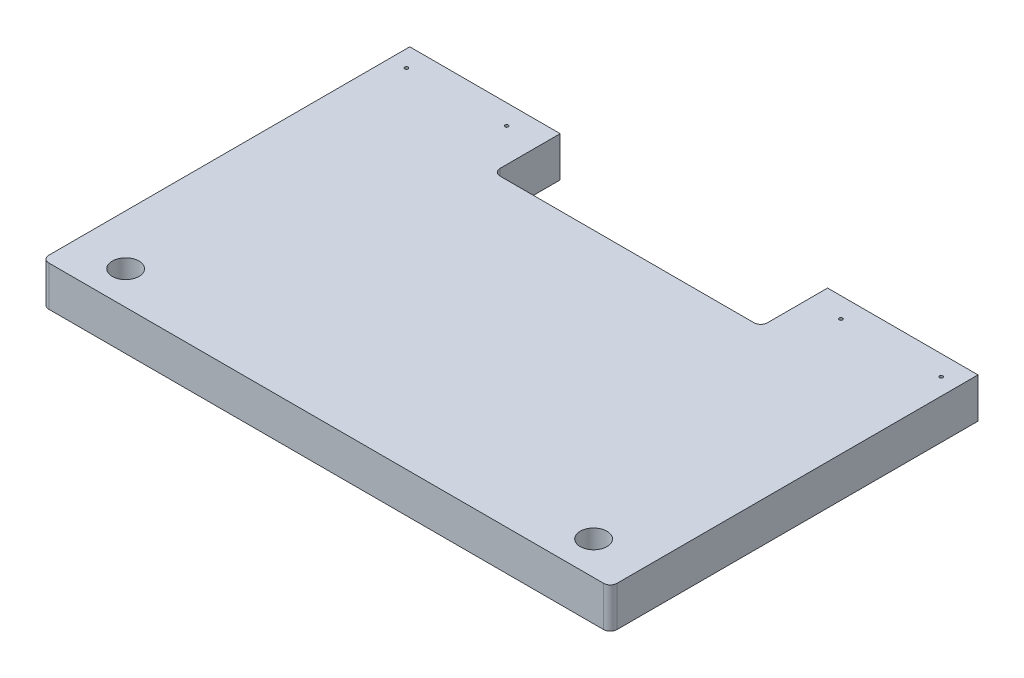
ISO-10303-21;
HEADER;
FILE_DESCRIPTION(('STEP AP214'),'2;1');
FILE_NAME('part.step','',(''),(''),'','','');
FILE_SCHEMA(('AUTOMOTIVE_DESIGN { 1 0 10303 214 1 1 1 1 }'));
ENDSEC;
DATA;
#1=APPLICATION_CONTEXT('core data for automotive mechanical design processes');
#2=APPLICATION_PROTOCOL_DEFINITION('international standard','automotive_design',2000,#1);
#3=PRODUCT_CONTEXT('',#1,'mechanical');
#4=PRODUCT('Part','Part','',(#3));
#5=PRODUCT_RELATED_PRODUCT_CATEGORY('part','',(#4));
#6=PRODUCT_DEFINITION_FORMATION('','',#4);
#7=PRODUCT_DEFINITION_CONTEXT('part definition',#1,'design');
#8=PRODUCT_DEFINITION('design','',#6,#7);
#9=PRODUCT_DEFINITION_SHAPE('','',#8);
#10=(LENGTH_UNIT() NAMED_UNIT(*) SI_UNIT(.MILLI.,.METRE.));
#11=(NAMED_UNIT(*) PLANE_ANGLE_UNIT() SI_UNIT($,.RADIAN.));
#12=(NAMED_UNIT(*) SI_UNIT($,.STERADIAN.) SOLID_ANGLE_UNIT());
#13=UNCERTAINTY_MEASURE_WITH_UNIT(LENGTH_MEASURE(1.E-05),#10,'distance_accuracy_value','');
#14=(GEOMETRIC_REPRESENTATION_CONTEXT(3) GLOBAL_UNCERTAINTY_ASSIGNED_CONTEXT((#13)) GLOBAL_UNIT_ASSIGNED_CONTEXT((#10,
#11,#12)) REPRESENTATION_CONTEXT('',''));
#15=CARTESIAN_POINT('',(0.,0.,0.));
#16=DIRECTION('',(0.,0.,1.));
#17=DIRECTION('',(1.,0.,0.));
#18=AXIS2_PLACEMENT_3D('',#15,#16,#17);
#19=CARTESIAN_POINT('',(0.,12.,0.));
#20=DIRECTION('',(0.,-1.,0.));
#21=DIRECTION('',(0.,0.,-1.));
#22=AXIS2_PLACEMENT_3D('',#19,#20,#21);
#23=PLANE('',#22);
#24=DIRECTION('',(1.,0.,0.));
#25=VECTOR('',#24,1.);
#26=CARTESIAN_POINT('',(0.,12.,0.));
#27=LINE('',#26,#25);
#28=CARTESIAN_POINT('',(2.,12.,0.));
#29=VERTEX_POINT('',#28);
#30=CARTESIAN_POINT('',(168.,12.,0.));
#31=VERTEX_POINT('',#30);
#32=EDGE_CURVE('E138',#29,#31,#27,.T.);
#33=ORIENTED_EDGE('',*,*,#32,.T.);
#34=CARTESIAN_POINT('',(168.,12.,-2.00000000000002));
#35=DIRECTION('',(0.,-1.,0.));
#36=DIRECTION('',(0.,0.,-1.));
#37=AXIS2_PLACEMENT_3D('',#34,#35,#36);
#38=CIRCLE('',#37,2.);
#39=CARTESIAN_POINT('',(170.,12.,-2.00000000000002));
#40=VERTEX_POINT('',#39);
#41=EDGE_CURVE('E134',#31,#40,#38,.F.);
#42=ORIENTED_EDGE('',*,*,#41,.T.);
#43=DIRECTION('',(0.,0.,-1.));
#44=VECTOR('',#43,1.);
#45=CARTESIAN_POINT('',(170.,12.,0.));
#46=LINE('',#45,#44);
#47=CARTESIAN_POINT('',(170.,12.,-110.));
#48=VERTEX_POINT('',#47);
#49=EDGE_CURVE('E126',#40,#48,#46,.T.);
#50=ORIENTED_EDGE('',*,*,#49,.T.);
#51=DIRECTION('',(-1.,0.,0.));
#52=VECTOR('',#51,1.);
#53=CARTESIAN_POINT('',(125.,12.,-110.));
#54=LINE('',#53,#52);
#55=CARTESIAN_POINT('',(125.,12.,-110.));
#56=VERTEX_POINT('',#55);
#57=EDGE_CURVE('E131',#48,#56,#54,.T.);
#58=ORIENTED_EDGE('',*,*,#57,.T.);
#59=DIRECTION('',(0.,0.,1.));
#60=VECTOR('',#59,1.);
#61=CARTESIAN_POINT('',(125.,12.,-90.));
#62=LINE('',#61,#60);
#63=CARTESIAN_POINT('',(125.,12.,-92.));
#64=VERTEX_POINT('',#63);
#65=EDGE_CURVE('E153',#56,#64,#62,.T.);
#66=ORIENTED_EDGE('',*,*,#65,.T.);
#67=CARTESIAN_POINT('',(123.,12.,-92.));
#68=DIRECTION('',(0.,-1.,0.));
#69=DIRECTION('',(0.,0.,-1.));
#70=AXIS2_PLACEMENT_3D('',#67,#68,#69);
#71=CIRCLE('',#70,2.);
#72=CARTESIAN_POINT('',(123.,12.,-90.));
#73=VERTEX_POINT('',#72);
#74=EDGE_CURVE('E216',#64,#73,#71,.T.);
#75=ORIENTED_EDGE('',*,*,#74,.T.);
#76=DIRECTION('',(-1.,0.,0.));
#77=VECTOR('',#76,1.);
#78=CARTESIAN_POINT('',(45.,12.,-90.));
#79=LINE('',#78,#77);
#80=CARTESIAN_POINT('',(47.,12.,-90.));
#81=VERTEX_POINT('',#80);
#82=EDGE_CURVE('E155',#73,#81,#79,.T.);
#83=ORIENTED_EDGE('',*,*,#82,.T.);
#84=CARTESIAN_POINT('',(47.,12.,-92.));
#85=DIRECTION('',(0.,-1.,0.));
#86=DIRECTION('',(0.,0.,-1.));
#87=AXIS2_PLACEMENT_3D('',#84,#85,#86);
#88=CIRCLE('',#87,2.);
#89=CARTESIAN_POINT('',(45.,12.,-92.));
#90=VERTEX_POINT('',#89);
#91=EDGE_CURVE('E12',#81,#90,#88,.T.);
#92=ORIENTED_EDGE('',*,*,#91,.T.);
#93=DIRECTION('',(0.,0.,-1.));
#94=VECTOR('',#93,1.);
#95=CARTESIAN_POINT('',(45.,12.,-110.));
#96=LINE('',#95,#94);
#97=CARTESIAN_POINT('',(45.,12.,-110.));
#98=VERTEX_POINT('',#97);
#99=EDGE_CURVE('E161',#90,#98,#96,.T.);
#100=ORIENTED_EDGE('',*,*,#99,.T.);
#101=DIRECTION('',(-1.,0.,0.));
#102=VECTOR('',#101,1.);
#103=CARTESIAN_POINT('',(0.,12.,-110.));
#104=LINE('',#103,#102);
#105=CARTESIAN_POINT('',(0.,12.,-110.));
#106=VERTEX_POINT('',#105);
#107=EDGE_CURVE('E163',#98,#106,#104,.T.);
#108=ORIENTED_EDGE('',*,*,#107,.T.);
#109=DIRECTION('',(0.,0.,1.));
#110=VECTOR('',#109,1.);
#111=CARTESIAN_POINT('',(0.,12.,0.));
#112=LINE('',#111,#110);
#113=CARTESIAN_POINT('',(0.,12.,-2.));
#114=VERTEX_POINT('',#113);
#115=EDGE_CURVE('E184',#106,#114,#112,.T.);
#116=ORIENTED_EDGE('',*,*,#115,.T.);
#117=CARTESIAN_POINT('',(2.,12.,-2.));
#118=DIRECTION('',(0.,-1.,0.));
#119=DIRECTION('',(0.,0.,-1.));
#120=AXIS2_PLACEMENT_3D('',#117,#118,#119);
#121=CIRCLE('',#120,2.);
#122=EDGE_CURVE('E210',#114,#29,#121,.F.);
#123=ORIENTED_EDGE('',*,*,#122,.T.);
#124=EDGE_LOOP('',(#33,#42,#50,#58,#66,#75,#83,#92,#100,#108,#116,#123));
#125=FACE_BOUND('',#124,.T.);
#126=CARTESIAN_POINT('',(155.,12.,-10.));
#127=DIRECTION('',(0.,1.,0.));
#128=DIRECTION('',(0.,0.,1.));
#129=AXIS2_PLACEMENT_3D('',#126,#127,#128);
#130=CIRCLE('',#129,3.99999999999999);
#131=CARTESIAN_POINT('',(155.,12.,-6.00000000000001));
#132=VERTEX_POINT('',#131);
#133=EDGE_CURVE('E169',#132,#132,#130,.T.);
#134=ORIENTED_EDGE('',*,*,#133,.F.);
#135=EDGE_LOOP('',(#134));
#136=FACE_BOUND('',#135,.T.);
#137=CARTESIAN_POINT('',(15.,12.,-10.));
#138=DIRECTION('',(0.,1.,0.));
#139=DIRECTION('',(0.,0.,-1.));
#140=AXIS2_PLACEMENT_3D('',#137,#138,#139);
#141=CIRCLE('',#140,3.99999999999999);
#142=CARTESIAN_POINT('',(15.,12.,-14.));
#143=VERTEX_POINT('',#142);
#144=EDGE_CURVE('E323',#143,#143,#141,.T.);
#145=ORIENTED_EDGE('',*,*,#144,.F.);
#146=EDGE_LOOP('',(#145));
#147=FACE_BOUND('',#146,.T.);
#148=CARTESIAN_POINT('',(5.,12.,-104.));
#149=DIRECTION('',(0.,1.,0.));
#150=DIRECTION('',(0.,0.,1.));
#151=AXIS2_PLACEMENT_3D('',#148,#149,#150);
#152=CIRCLE('',#151,0.500000000000002);
#153=CARTESIAN_POINT('',(5.,12.,-103.5));
#154=VERTEX_POINT('',#153);
#155=EDGE_CURVE('E327',#154,#154,#152,.T.);
#156=ORIENTED_EDGE('',*,*,#155,.F.);
#157=EDGE_LOOP('',(#156));
#158=FACE_BOUND('',#157,.T.);
#159=CARTESIAN_POINT('',(35.,12.,-104.));
#160=DIRECTION('',(0.,1.,0.));
#161=DIRECTION('',(0.,0.,1.));
#162=AXIS2_PLACEMENT_3D('',#159,#160,#161);
#163=CIRCLE('',#162,0.499999999999999);
#164=CARTESIAN_POINT('',(35.,12.,-103.5));
#165=VERTEX_POINT('',#164);
#166=EDGE_CURVE('E346',#165,#165,#163,.T.);
#167=ORIENTED_EDGE('',*,*,#166,.F.);
#168=EDGE_LOOP('',(#167));
#169=FACE_BOUND('',#168,.T.);
#170=CARTESIAN_POINT('',(165.,12.,-104.));
#171=DIRECTION('',(0.,1.,0.));
#172=DIRECTION('',(0.,0.,-1.));
#173=AXIS2_PLACEMENT_3D('',#170,#171,#172);
#174=CIRCLE('',#173,0.499999999999999);
#175=CARTESIAN_POINT('',(165.,12.,-104.5));
#176=VERTEX_POINT('',#175);
#177=EDGE_CURVE('E355',#176,#176,#174,.T.);
#178=ORIENTED_EDGE('',*,*,#177,.F.);
#179=EDGE_LOOP('',(#178));
#180=FACE_BOUND('',#179,.T.);
#181=CARTESIAN_POINT('',(135.,12.,-104.));
#182=DIRECTION('',(0.,1.,0.));
#183=DIRECTION('',(0.,0.,-1.));
#184=AXIS2_PLACEMENT_3D('',#181,#182,#183);
#185=CIRCLE('',#184,0.499999999999999);
#186=CARTESIAN_POINT('',(135.,12.,-104.5));
#187=VERTEX_POINT('',#186);
#188=EDGE_CURVE('E369',#187,#187,#185,.T.);
#189=ORIENTED_EDGE('',*,*,#188,.F.);
#190=EDGE_LOOP('',(#189));
#191=FACE_BOUND('',#190,.T.);
#192=ADVANCED_FACE('F35',(#125,#136,#147,#158,#169,#180,#191),#23,.F.);
#193=CARTESIAN_POINT('',(0.,0.,0.));
#194=DIRECTION('',(0.,-1.,0.));
#195=DIRECTION('',(0.,0.,-1.));
#196=AXIS2_PLACEMENT_3D('',#193,#194,#195);
#197=PLANE('',#196);
#198=CARTESIAN_POINT('',(165.,0.,-104.));
#199=DIRECTION('',(0.,1.,0.));
#200=DIRECTION('',(0.,0.,-1.));
#201=AXIS2_PLACEMENT_3D('',#198,#199,#200);
#202=CIRCLE('',#201,0.499999999999999);
#203=CARTESIAN_POINT('',(165.,0.,-104.5));
#204=VERTEX_POINT('',#203);
#205=EDGE_CURVE('E352',#204,#204,#202,.T.);
#206=ORIENTED_EDGE('',*,*,#205,.T.);
#207=EDGE_LOOP('',(#206));
#208=FACE_BOUND('',#207,.T.);
#209=CARTESIAN_POINT('',(5.,0.,-104.));
#210=DIRECTION('',(0.,1.,0.));
#211=DIRECTION('',(0.,0.,1.));
#212=AXIS2_PLACEMENT_3D('',#209,#210,#211);
#213=CIRCLE('',#212,0.500000000000002);
#214=CARTESIAN_POINT('',(5.,0.,-103.5));
#215=VERTEX_POINT('',#214);
#216=EDGE_CURVE('E332',#215,#215,#213,.T.);
#217=ORIENTED_EDGE('',*,*,#216,.T.);
#218=EDGE_LOOP('',(#217));
#219=FACE_BOUND('',#218,.T.);
#220=CARTESIAN_POINT('',(155.,0.,-10.));
#221=DIRECTION('',(0.,1.,0.));
#222=DIRECTION('',(0.,0.,1.));
#223=AXIS2_PLACEMENT_3D('',#220,#221,#222);
#224=CIRCLE('',#223,3.99999999999999);
#225=CARTESIAN_POINT('',(155.,0.,-6.00000000000001));
#226=VERTEX_POINT('',#225);
#227=EDGE_CURVE('E329',#226,#226,#224,.T.);
#228=ORIENTED_EDGE('',*,*,#227,.T.);
#229=EDGE_LOOP('',(#228));
#230=FACE_BOUND('',#229,.T.);
#231=DIRECTION('',(0.,0.,-1.));
#232=VECTOR('',#231,1.);
#233=CARTESIAN_POINT('',(170.,0.,0.));
#234=LINE('',#233,#232);
#235=CARTESIAN_POINT('',(170.,0.,-2.00000000000002));
#236=VERTEX_POINT('',#235);
#237=CARTESIAN_POINT('',(170.,0.,-110.));
#238=VERTEX_POINT('',#237);
#239=EDGE_CURVE('E144',#236,#238,#234,.T.);
#240=ORIENTED_EDGE('',*,*,#239,.F.);
#241=CARTESIAN_POINT('',(168.,0.,-2.00000000000002));
#242=DIRECTION('',(0.,-1.,0.));
#243=DIRECTION('',(0.,0.,-1.));
#244=AXIS2_PLACEMENT_3D('',#241,#242,#243);
#245=CIRCLE('',#244,2.);
#246=CARTESIAN_POINT('',(168.,0.,0.));
#247=VERTEX_POINT('',#246);
#248=EDGE_CURVE('E204',#236,#247,#245,.T.);
#249=ORIENTED_EDGE('',*,*,#248,.T.);
#250=DIRECTION('',(1.,0.,0.));
#251=VECTOR('',#250,1.);
#252=CARTESIAN_POINT('',(0.,0.,0.));
#253=LINE('',#252,#251);
#254=CARTESIAN_POINT('',(2.,0.,0.));
#255=VERTEX_POINT('',#254);
#256=EDGE_CURVE('E168',#255,#247,#253,.T.);
#257=ORIENTED_EDGE('',*,*,#256,.F.);
#258=CARTESIAN_POINT('',(2.,0.,-2.));
#259=DIRECTION('',(0.,-1.,0.));
#260=DIRECTION('',(0.,0.,-1.));
#261=AXIS2_PLACEMENT_3D('',#258,#259,#260);
#262=CIRCLE('',#261,2.);
#263=CARTESIAN_POINT('',(0.,0.,-2.));
#264=VERTEX_POINT('',#263);
#265=EDGE_CURVE('E202',#255,#264,#262,.T.);
#266=ORIENTED_EDGE('',*,*,#265,.T.);
#267=DIRECTION('',(0.,0.,1.));
#268=VECTOR('',#267,1.);
#269=CARTESIAN_POINT('',(0.,0.,0.));
#270=LINE('',#269,#268);
#271=CARTESIAN_POINT('',(0.,0.,-110.));
#272=VERTEX_POINT('',#271);
#273=EDGE_CURVE('E166',#272,#264,#270,.T.);
#274=ORIENTED_EDGE('',*,*,#273,.F.);
#275=DIRECTION('',(-1.,0.,0.));
#276=VECTOR('',#275,1.);
#277=CARTESIAN_POINT('',(0.,0.,-110.));
#278=LINE('',#277,#276);
#279=CARTESIAN_POINT('',(45.,0.,-110.));
#280=VERTEX_POINT('',#279);
#281=EDGE_CURVE('E182',#280,#272,#278,.T.);
#282=ORIENTED_EDGE('',*,*,#281,.F.);
#283=DIRECTION('',(0.,0.,-1.));
#284=VECTOR('',#283,1.);
#285=CARTESIAN_POINT('',(45.,0.,-110.));
#286=LINE('',#285,#284);
#287=CARTESIAN_POINT('',(45.,0.,-92.));
#288=VERTEX_POINT('',#287);
#289=EDGE_CURVE('E180',#288,#280,#286,.T.);
#290=ORIENTED_EDGE('',*,*,#289,.F.);
#291=CARTESIAN_POINT('',(47.,0.,-92.));
#292=DIRECTION('',(0.,-1.,0.));
#293=DIRECTION('',(0.,0.,-1.));
#294=AXIS2_PLACEMENT_3D('',#291,#292,#293);
#295=CIRCLE('',#294,2.);
#296=CARTESIAN_POINT('',(47.,0.,-90.));
#297=VERTEX_POINT('',#296);
#298=EDGE_CURVE('E43',#288,#297,#295,.F.);
#299=ORIENTED_EDGE('',*,*,#298,.T.);
#300=DIRECTION('',(-1.,0.,0.));
#301=VECTOR('',#300,1.);
#302=CARTESIAN_POINT('',(45.,0.,-90.));
#303=LINE('',#302,#301);
#304=CARTESIAN_POINT('',(123.,0.,-90.));
#305=VERTEX_POINT('',#304);
#306=EDGE_CURVE('E177',#305,#297,#303,.T.);
#307=ORIENTED_EDGE('',*,*,#306,.F.);
#308=CARTESIAN_POINT('',(123.,0.,-92.));
#309=DIRECTION('',(0.,-1.,0.));
#310=DIRECTION('',(0.,0.,-1.));
#311=AXIS2_PLACEMENT_3D('',#308,#309,#310);
#312=CIRCLE('',#311,2.);
#313=CARTESIAN_POINT('',(125.,0.,-92.));
#314=VERTEX_POINT('',#313);
#315=EDGE_CURVE('E214',#305,#314,#312,.F.);
#316=ORIENTED_EDGE('',*,*,#315,.T.);
#317=DIRECTION('',(0.,0.,1.));
#318=VECTOR('',#317,1.);
#319=CARTESIAN_POINT('',(125.,0.,-90.));
#320=LINE('',#319,#318);
#321=CARTESIAN_POINT('',(125.,0.,-110.));
#322=VERTEX_POINT('',#321);
#323=EDGE_CURVE('E174',#322,#314,#320,.T.);
#324=ORIENTED_EDGE('',*,*,#323,.F.);
#325=DIRECTION('',(-1.,0.,0.));
#326=VECTOR('',#325,1.);
#327=CARTESIAN_POINT('',(125.,0.,-110.));
#328=LINE('',#327,#326);
#329=EDGE_CURVE('E172',#238,#322,#328,.T.);
#330=ORIENTED_EDGE('',*,*,#329,.F.);
#331=EDGE_LOOP('',(#240,#249,#257,#266,#274,#282,#290,#299,#307,#316,#324,#330));
#332=FACE_BOUND('',#331,.T.);
#333=CARTESIAN_POINT('',(15.,0.,-10.));
#334=DIRECTION('',(0.,1.,0.));
#335=DIRECTION('',(0.,0.,-1.));
#336=AXIS2_PLACEMENT_3D('',#333,#334,#335);
#337=CIRCLE('',#336,3.99999999999999);
#338=CARTESIAN_POINT('',(15.,0.,-14.));
#339=VERTEX_POINT('',#338);
#340=EDGE_CURVE('E326',#339,#339,#337,.T.);
#341=ORIENTED_EDGE('',*,*,#340,.T.);
#342=EDGE_LOOP('',(#341));
#343=FACE_BOUND('',#342,.T.);
#344=CARTESIAN_POINT('',(35.,0.,-104.));
#345=DIRECTION('',(0.,1.,0.));
#346=DIRECTION('',(0.,0.,1.));
#347=AXIS2_PLACEMENT_3D('',#344,#345,#346);
#348=CIRCLE('',#347,0.499999999999999);
#349=CARTESIAN_POINT('',(35.,0.,-103.5));
#350=VERTEX_POINT('',#349);
#351=EDGE_CURVE('E351',#350,#350,#348,.T.);
#352=ORIENTED_EDGE('',*,*,#351,.T.);
#353=EDGE_LOOP('',(#352));
#354=FACE_BOUND('',#353,.T.);
#355=CARTESIAN_POINT('',(135.,0.,-104.));
#356=DIRECTION('',(0.,1.,0.));
#357=DIRECTION('',(0.,0.,-1.));
#358=AXIS2_PLACEMENT_3D('',#355,#356,#357);
#359=CIRCLE('',#358,0.499999999999999);
#360=CARTESIAN_POINT('',(135.,0.,-104.5));
#361=VERTEX_POINT('',#360);
#362=EDGE_CURVE('E372',#361,#361,#359,.T.);
#363=ORIENTED_EDGE('',*,*,#362,.T.);
#364=EDGE_LOOP('',(#363));
#365=FACE_BOUND('',#364,.T.);
#366=ADVANCED_FACE('F220',(#208,#219,#230,#332,#343,#354,#365),#197,.T.);
#367=CARTESIAN_POINT('',(0.,12.,0.));
#368=DIRECTION('',(1.,0.,0.));
#369=DIRECTION('',(0.,0.,-1.));
#370=AXIS2_PLACEMENT_3D('',#367,#368,#369);
#371=PLANE('',#370);
#372=ORIENTED_EDGE('',*,*,#273,.T.);
#373=DIRECTION('',(0.,-1.,0.));
#374=VECTOR('',#373,1.);
#375=CARTESIAN_POINT('',(0.,12.,-2.));
#376=LINE('',#375,#374);
#377=EDGE_CURVE('E50',#264,#114,#376,.F.);
#378=ORIENTED_EDGE('',*,*,#377,.T.);
#379=ORIENTED_EDGE('',*,*,#115,.F.);
#380=DIRECTION('',(0.,-1.,0.));
#381=VECTOR('',#380,1.);
#382=CARTESIAN_POINT('',(0.,12.,-110.));
#383=LINE('',#382,#381);
#384=EDGE_CURVE('E165',#106,#272,#383,.T.);
#385=ORIENTED_EDGE('',*,*,#384,.T.);
#386=EDGE_LOOP('',(#372,#378,#379,#385));
#387=FACE_BOUND('',#386,.T.);
#388=ADVANCED_FACE('F261',(#387),#371,.F.);
#389=CARTESIAN_POINT('',(0.,12.,0.));
#390=DIRECTION('',(0.,0.,-1.));
#391=DIRECTION('',(-1.,0.,0.));
#392=AXIS2_PLACEMENT_3D('',#389,#390,#391);
#393=PLANE('',#392);
#394=ORIENTED_EDGE('',*,*,#256,.T.);
#395=DIRECTION('',(0.,-1.,0.));
#396=VECTOR('',#395,1.);
#397=CARTESIAN_POINT('',(168.,12.,0.));
#398=LINE('',#397,#396);
#399=EDGE_CURVE('E58',#247,#31,#398,.F.);
#400=ORIENTED_EDGE('',*,*,#399,.T.);
#401=ORIENTED_EDGE('',*,*,#32,.F.);
#402=DIRECTION('',(0.,-1.,0.));
#403=VECTOR('',#402,1.);
#404=CARTESIAN_POINT('',(2.,12.,0.));
#405=LINE('',#404,#403);
#406=EDGE_CURVE('E206',#29,#255,#405,.T.);
#407=ORIENTED_EDGE('',*,*,#406,.T.);
#408=EDGE_LOOP('',(#394,#400,#401,#407));
#409=FACE_BOUND('',#408,.T.);
#410=ADVANCED_FACE('F245',(#409),#393,.F.);
#411=CARTESIAN_POINT('',(170.,12.,0.));
#412=DIRECTION('',(-1.,0.,0.));
#413=DIRECTION('',(0.,0.,1.));
#414=AXIS2_PLACEMENT_3D('',#411,#412,#413);
#415=PLANE('',#414);
#416=ORIENTED_EDGE('',*,*,#49,.F.);
#417=DIRECTION('',(0.,-1.,0.));
#418=VECTOR('',#417,1.);
#419=CARTESIAN_POINT('',(170.,12.,-2.00000000000002));
#420=LINE('',#419,#418);
#421=EDGE_CURVE('E200',#40,#236,#420,.T.);
#422=ORIENTED_EDGE('',*,*,#421,.T.);
#423=ORIENTED_EDGE('',*,*,#239,.T.);
#424=DIRECTION('',(0.,-1.,0.));
#425=VECTOR('',#424,1.);
#426=CARTESIAN_POINT('',(170.,12.,-110.));
#427=LINE('',#426,#425);
#428=EDGE_CURVE('E141',#48,#238,#427,.T.);
#429=ORIENTED_EDGE('',*,*,#428,.F.);
#430=EDGE_LOOP('',(#416,#422,#423,#429));
#431=FACE_BOUND('',#430,.T.);
#432=ADVANCED_FACE('F142',(#431),#415,.F.);
#433=CARTESIAN_POINT('',(125.,12.,-110.));
#434=DIRECTION('',(0.,0.,1.));
#435=DIRECTION('',(1.,0.,0.));
#436=AXIS2_PLACEMENT_3D('',#433,#434,#435);
#437=PLANE('',#436);
#438=ORIENTED_EDGE('',*,*,#329,.T.);
#439=DIRECTION('',(0.,-1.,0.));
#440=VECTOR('',#439,1.);
#441=CARTESIAN_POINT('',(125.,12.,-110.));
#442=LINE('',#441,#440);
#443=EDGE_CURVE('E148',#56,#322,#442,.T.);
#444=ORIENTED_EDGE('',*,*,#443,.F.);
#445=ORIENTED_EDGE('',*,*,#57,.F.);
#446=ORIENTED_EDGE('',*,*,#428,.T.);
#447=EDGE_LOOP('',(#438,#444,#445,#446));
#448=FACE_BOUND('',#447,.T.);
#449=ADVANCED_FACE('F150',(#448),#437,.F.);
#450=CARTESIAN_POINT('',(125.,12.,-90.));
#451=DIRECTION('',(1.,0.,0.));
#452=DIRECTION('',(0.,0.,-1.));
#453=AXIS2_PLACEMENT_3D('',#450,#451,#452);
#454=PLANE('',#453);
#455=ORIENTED_EDGE('',*,*,#323,.T.);
#456=DIRECTION('',(0.,-1.,0.));
#457=VECTOR('',#456,1.);
#458=CARTESIAN_POINT('',(125.,12.,-92.));
#459=LINE('',#458,#457);
#460=EDGE_CURVE('E195',#314,#64,#459,.F.);
#461=ORIENTED_EDGE('',*,*,#460,.T.);
#462=ORIENTED_EDGE('',*,*,#65,.F.);
#463=ORIENTED_EDGE('',*,*,#443,.T.);
#464=EDGE_LOOP('',(#455,#461,#462,#463));
#465=FACE_BOUND('',#464,.T.);
#466=ADVANCED_FACE('F274',(#465),#454,.F.);
#467=CARTESIAN_POINT('',(45.,12.,-90.));
#468=DIRECTION('',(0.,0.,1.));
#469=DIRECTION('',(1.,0.,0.));
#470=AXIS2_PLACEMENT_3D('',#467,#468,#469);
#471=PLANE('',#470);
#472=ORIENTED_EDGE('',*,*,#82,.F.);
#473=DIRECTION('',(0.,-1.,0.));
#474=VECTOR('',#473,1.);
#475=CARTESIAN_POINT('',(123.,0.,-90.));
#476=LINE('',#475,#474);
#477=EDGE_CURVE('E192',#73,#305,#476,.T.);
#478=ORIENTED_EDGE('',*,*,#477,.T.);
#479=ORIENTED_EDGE('',*,*,#306,.T.);
#480=DIRECTION('',(0.,-1.,0.));
#481=VECTOR('',#480,1.);
#482=CARTESIAN_POINT('',(47.,12.,-90.));
#483=LINE('',#482,#481);
#484=EDGE_CURVE('E147',#297,#81,#483,.F.);
#485=ORIENTED_EDGE('',*,*,#484,.T.);
#486=EDGE_LOOP('',(#472,#478,#479,#485));
#487=FACE_BOUND('',#486,.T.);
#488=ADVANCED_FACE('F228',(#487),#471,.F.);
#489=CARTESIAN_POINT('',(45.,12.,-110.));
#490=DIRECTION('',(-1.,0.,0.));
#491=DIRECTION('',(0.,0.,1.));
#492=AXIS2_PLACEMENT_3D('',#489,#490,#491);
#493=PLANE('',#492);
#494=ORIENTED_EDGE('',*,*,#99,.F.);
#495=DIRECTION('',(0.,-1.,0.));
#496=VECTOR('',#495,1.);
#497=CARTESIAN_POINT('',(45.,0.,-92.));
#498=LINE('',#497,#496);
#499=EDGE_CURVE('E197',#90,#288,#498,.T.);
#500=ORIENTED_EDGE('',*,*,#499,.T.);
#501=ORIENTED_EDGE('',*,*,#289,.T.);
#502=DIRECTION('',(0.,-1.,0.));
#503=VECTOR('',#502,1.);
#504=CARTESIAN_POINT('',(45.,12.,-110.));
#505=LINE('',#504,#503);
#506=EDGE_CURVE('E187',#98,#280,#505,.T.);
#507=ORIENTED_EDGE('',*,*,#506,.F.);
#508=EDGE_LOOP('',(#494,#500,#501,#507));
#509=FACE_BOUND('',#508,.T.);
#510=ADVANCED_FACE('F235',(#509),#493,.F.);
#511=CARTESIAN_POINT('',(0.,12.,-110.));
#512=DIRECTION('',(0.,0.,1.));
#513=DIRECTION('',(1.,0.,0.));
#514=AXIS2_PLACEMENT_3D('',#511,#512,#513);
#515=PLANE('',#514);
#516=ORIENTED_EDGE('',*,*,#281,.T.);
#517=ORIENTED_EDGE('',*,*,#384,.F.);
#518=ORIENTED_EDGE('',*,*,#107,.F.);
#519=ORIENTED_EDGE('',*,*,#506,.T.);
#520=EDGE_LOOP('',(#516,#517,#518,#519));
#521=FACE_BOUND('',#520,.T.);
#522=ADVANCED_FACE('F239',(#521),#515,.F.);
#523=CARTESIAN_POINT('',(155.,12.,-10.));
#524=DIRECTION('',(0.,-1.,0.));
#525=DIRECTION('',(0.,0.,-1.));
#526=AXIS2_PLACEMENT_3D('',#523,#524,#525);
#527=CYLINDRICAL_SURFACE('',#526,3.99999999999999);
#528=ORIENTED_EDGE('',*,*,#133,.T.);
#529=EDGE_LOOP('',(#528));
#530=FACE_BOUND('',#529,.T.);
#531=ORIENTED_EDGE('',*,*,#227,.F.);
#532=EDGE_LOOP('',(#531));
#533=FACE_BOUND('',#532,.T.);
#534=ADVANCED_FACE('F265',(#530,#533),#527,.F.);
#535=CARTESIAN_POINT('',(15.,12.,-10.));
#536=DIRECTION('',(0.,-1.,0.));
#537=DIRECTION('',(0.,0.,-1.));
#538=AXIS2_PLACEMENT_3D('',#535,#536,#537);
#539=CYLINDRICAL_SURFACE('',#538,3.99999999999999);
#540=ORIENTED_EDGE('',*,*,#144,.T.);
#541=EDGE_LOOP('',(#540));
#542=FACE_BOUND('',#541,.T.);
#543=ORIENTED_EDGE('',*,*,#340,.F.);
#544=EDGE_LOOP('',(#543));
#545=FACE_BOUND('',#544,.T.);
#546=ADVANCED_FACE('F312',(#542,#545),#539,.F.);
#547=CARTESIAN_POINT('',(5.,12.,-104.));
#548=DIRECTION('',(0.,-1.,0.));
#549=DIRECTION('',(0.,0.,-1.));
#550=AXIS2_PLACEMENT_3D('',#547,#548,#549);
#551=CYLINDRICAL_SURFACE('',#550,0.500000000000002);
#552=ORIENTED_EDGE('',*,*,#155,.T.);
#553=EDGE_LOOP('',(#552));
#554=FACE_BOUND('',#553,.T.);
#555=ORIENTED_EDGE('',*,*,#216,.F.);
#556=EDGE_LOOP('',(#555));
#557=FACE_BOUND('',#556,.T.);
#558=ADVANCED_FACE('F309',(#554,#557),#551,.F.);
#559=CARTESIAN_POINT('',(35.,12.,-104.));
#560=DIRECTION('',(0.,-1.,0.));
#561=DIRECTION('',(0.,0.,-1.));
#562=AXIS2_PLACEMENT_3D('',#559,#560,#561);
#563=CYLINDRICAL_SURFACE('',#562,0.499999999999999);
#564=ORIENTED_EDGE('',*,*,#166,.T.);
#565=EDGE_LOOP('',(#564));
#566=FACE_BOUND('',#565,.T.);
#567=ORIENTED_EDGE('',*,*,#351,.F.);
#568=EDGE_LOOP('',(#567));
#569=FACE_BOUND('',#568,.T.);
#570=ADVANCED_FACE('F301',(#566,#569),#563,.F.);
#571=CARTESIAN_POINT('',(165.,12.,-104.));
#572=DIRECTION('',(0.,-1.,0.));
#573=DIRECTION('',(0.,0.,-1.));
#574=AXIS2_PLACEMENT_3D('',#571,#572,#573);
#575=CYLINDRICAL_SURFACE('',#574,0.499999999999999);
#576=ORIENTED_EDGE('',*,*,#177,.T.);
#577=EDGE_LOOP('',(#576));
#578=FACE_BOUND('',#577,.T.);
#579=ORIENTED_EDGE('',*,*,#205,.F.);
#580=EDGE_LOOP('',(#579));
#581=FACE_BOUND('',#580,.T.);
#582=ADVANCED_FACE('F292',(#578,#581),#575,.F.);
#583=CARTESIAN_POINT('',(135.,12.,-104.));
#584=DIRECTION('',(0.,-1.,0.));
#585=DIRECTION('',(0.,0.,-1.));
#586=AXIS2_PLACEMENT_3D('',#583,#584,#585);
#587=CYLINDRICAL_SURFACE('',#586,0.499999999999999);
#588=ORIENTED_EDGE('',*,*,#188,.T.);
#589=EDGE_LOOP('',(#588));
#590=FACE_BOUND('',#589,.T.);
#591=ORIENTED_EDGE('',*,*,#362,.F.);
#592=EDGE_LOOP('',(#591));
#593=FACE_BOUND('',#592,.T.);
#594=ADVANCED_FACE('F287',(#590,#593),#587,.F.);
#595=CARTESIAN_POINT('',(123.,12.,-92.));
#596=DIRECTION('',(0.,1.,0.));
#597=DIRECTION('',(0.,0.,1.));
#598=AXIS2_PLACEMENT_3D('',#595,#596,#597);
#599=CYLINDRICAL_SURFACE('',#598,2.);
#600=ORIENTED_EDGE('',*,*,#74,.F.);
#601=ORIENTED_EDGE('',*,*,#460,.F.);
#602=ORIENTED_EDGE('',*,*,#315,.F.);
#603=ORIENTED_EDGE('',*,*,#477,.F.);
#604=EDGE_LOOP('',(#600,#601,#602,#603));
#605=FACE_BOUND('',#604,.T.);
#606=ADVANCED_FACE('F254',(#605),#599,.F.);
#607=CARTESIAN_POINT('',(47.,12.,-92.));
#608=DIRECTION('',(0.,1.,0.));
#609=DIRECTION('',(0.,0.,1.));
#610=AXIS2_PLACEMENT_3D('',#607,#608,#609);
#611=CYLINDRICAL_SURFACE('',#610,2.);
#612=ORIENTED_EDGE('',*,*,#91,.F.);
#613=ORIENTED_EDGE('',*,*,#484,.F.);
#614=ORIENTED_EDGE('',*,*,#298,.F.);
#615=ORIENTED_EDGE('',*,*,#499,.F.);
#616=EDGE_LOOP('',(#612,#613,#614,#615));
#617=FACE_BOUND('',#616,.T.);
#618=ADVANCED_FACE('F231',(#617),#611,.F.);
#619=CARTESIAN_POINT('',(168.,12.,-2.00000000000002));
#620=DIRECTION('',(0.,-1.,0.));
#621=DIRECTION('',(0.,0.,-1.));
#622=AXIS2_PLACEMENT_3D('',#619,#620,#621);
#623=CYLINDRICAL_SURFACE('',#622,2.);
#624=ORIENTED_EDGE('',*,*,#41,.F.);
#625=ORIENTED_EDGE('',*,*,#399,.F.);
#626=ORIENTED_EDGE('',*,*,#248,.F.);
#627=ORIENTED_EDGE('',*,*,#421,.F.);
#628=EDGE_LOOP('',(#624,#625,#626,#627));
#629=FACE_BOUND('',#628,.T.);
#630=ADVANCED_FACE('F248',(#629),#623,.T.);
#631=CARTESIAN_POINT('',(2.,12.,-2.));
#632=DIRECTION('',(0.,-1.,0.));
#633=DIRECTION('',(0.,0.,-1.));
#634=AXIS2_PLACEMENT_3D('',#631,#632,#633);
#635=CYLINDRICAL_SURFACE('',#634,2.);
#636=ORIENTED_EDGE('',*,*,#122,.F.);
#637=ORIENTED_EDGE('',*,*,#377,.F.);
#638=ORIENTED_EDGE('',*,*,#265,.F.);
#639=ORIENTED_EDGE('',*,*,#406,.F.);
#640=EDGE_LOOP('',(#636,#637,#638,#639));
#641=FACE_BOUND('',#640,.T.);
#642=ADVANCED_FACE('F37',(#641),#635,.T.);
#643=CLOSED_SHELL('',(#192,#366,#388,#410,#432,#449,#466,#488,#510,#522,#534,#546,#558,#570,
#582,#594,#606,#618,#630,#642));
#644=MANIFOLD_SOLID_BREP('B2',#643);
#645=ADVANCED_BREP_SHAPE_REPRESENTATION('',(#18,#644),#14);
#646=SHAPE_DEFINITION_REPRESENTATION(#9,#645);
ENDSEC;
END-ISO-10303-21;
